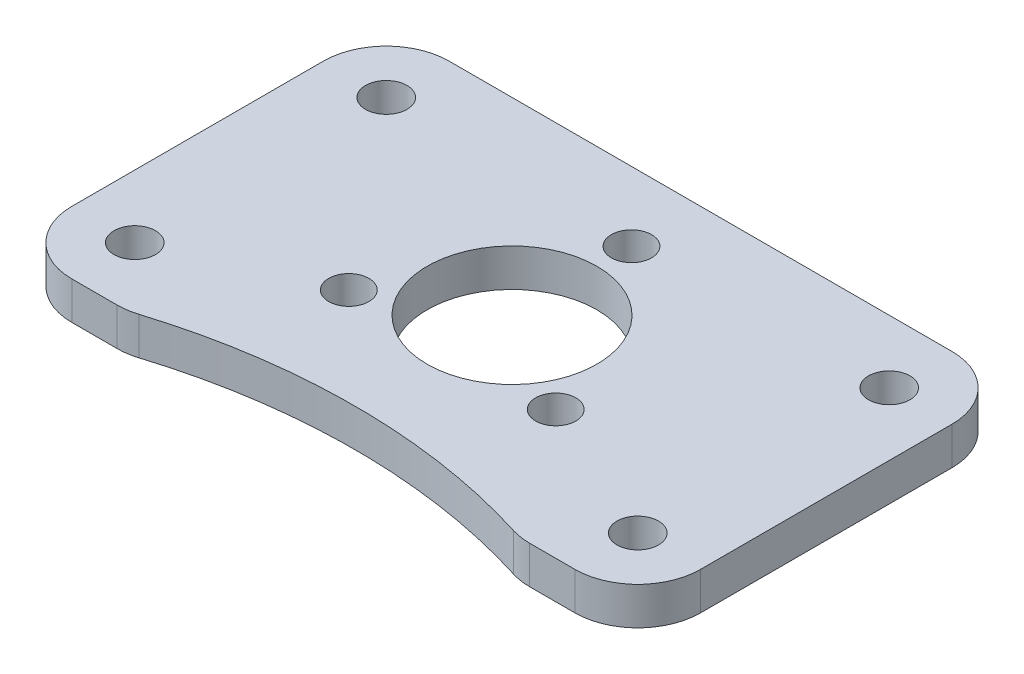
ISO-10303-21;
HEADER;
FILE_DESCRIPTION(('STEP AP214'),'2;1');
FILE_NAME('part.step','',(''),(''),'','','');
FILE_SCHEMA(('AUTOMOTIVE_DESIGN { 1 0 10303 214 1 1 1 1 }'));
ENDSEC;
DATA;
#1=APPLICATION_CONTEXT('core data for automotive mechanical design processes');
#2=APPLICATION_PROTOCOL_DEFINITION('international standard','automotive_design',2000,#1);
#3=PRODUCT_CONTEXT('',#1,'mechanical');
#4=PRODUCT('Part','Part','',(#3));
#5=PRODUCT_RELATED_PRODUCT_CATEGORY('part','',(#4));
#6=PRODUCT_DEFINITION_FORMATION('','',#4);
#7=PRODUCT_DEFINITION_CONTEXT('part definition',#1,'design');
#8=PRODUCT_DEFINITION('design','',#6,#7);
#9=PRODUCT_DEFINITION_SHAPE('','',#8);
#10=(LENGTH_UNIT() NAMED_UNIT(*) SI_UNIT(.MILLI.,.METRE.));
#11=(NAMED_UNIT(*) PLANE_ANGLE_UNIT() SI_UNIT($,.RADIAN.));
#12=(NAMED_UNIT(*) SI_UNIT($,.STERADIAN.) SOLID_ANGLE_UNIT());
#13=UNCERTAINTY_MEASURE_WITH_UNIT(LENGTH_MEASURE(1.E-05),#10,'distance_accuracy_value','');
#14=(GEOMETRIC_REPRESENTATION_CONTEXT(3) GLOBAL_UNCERTAINTY_ASSIGNED_CONTEXT((#13)) GLOBAL_UNIT_ASSIGNED_CONTEXT((#10,
#11,#12)) REPRESENTATION_CONTEXT('',''));
#15=CARTESIAN_POINT('',(0.,0.,0.));
#16=DIRECTION('',(0.,0.,1.));
#17=DIRECTION('',(1.,0.,0.));
#18=AXIS2_PLACEMENT_3D('',#15,#16,#17);
#19=CARTESIAN_POINT('',(25.,3.,47.5));
#20=DIRECTION('',(0.,1.,0.));
#21=DIRECTION('',(0.,0.,1.));
#22=AXIS2_PLACEMENT_3D('',#19,#20,#21);
#23=PLANE('',#22);
#24=CARTESIAN_POINT('',(33.2272413359522,3.,-10.25));
#25=DIRECTION('',(0.,1.,0.));
#26=DIRECTION('',(0.,0.,1.));
#27=AXIS2_PLACEMENT_3D('',#24,#25,#26);
#28=CIRCLE('',#27,1.6);
#29=CARTESIAN_POINT('',(33.2272413359522,3.,-8.65));
#30=VERTEX_POINT('',#29);
#31=EDGE_CURVE('E268',#30,#30,#28,.T.);
#32=ORIENTED_EDGE('',*,*,#31,.F.);
#33=EDGE_LOOP('',(#32));
#34=FACE_BOUND('',#33,.T.);
#35=CARTESIAN_POINT('',(25.,3.,-15.));
#36=DIRECTION('',(0.,1.,0.));
#37=DIRECTION('',(0.,0.,1.));
#38=AXIS2_PLACEMENT_3D('',#35,#36,#37);
#39=CIRCLE('',#38,6.75);
#40=CARTESIAN_POINT('',(25.,3.,-8.25));
#41=VERTEX_POINT('',#40);
#42=EDGE_CURVE('E262',#41,#41,#39,.T.);
#43=ORIENTED_EDGE('',*,*,#42,.F.);
#44=EDGE_LOOP('',(#43));
#45=FACE_BOUND('',#44,.T.);
#46=CARTESIAN_POINT('',(5.00000000000001,3.,-25.));
#47=DIRECTION('',(0.,1.,0.));
#48=DIRECTION('',(0.,0.,1.));
#49=AXIS2_PLACEMENT_3D('',#46,#47,#48);
#50=CIRCLE('',#49,1.65);
#51=CARTESIAN_POINT('',(5.00000000000001,3.,-23.35));
#52=VERTEX_POINT('',#51);
#53=EDGE_CURVE('E256',#52,#52,#50,.T.);
#54=ORIENTED_EDGE('',*,*,#53,.F.);
#55=EDGE_LOOP('',(#54));
#56=FACE_BOUND('',#55,.T.);
#57=CARTESIAN_POINT('',(45.,3.,-5.));
#58=DIRECTION('',(0.,1.,0.));
#59=DIRECTION('',(0.,0.,1.));
#60=AXIS2_PLACEMENT_3D('',#57,#58,#59);
#61=CIRCLE('',#60,1.65);
#62=CARTESIAN_POINT('',(45.,3.,-3.35));
#63=VERTEX_POINT('',#62);
#64=EDGE_CURVE('E251',#63,#63,#61,.T.);
#65=ORIENTED_EDGE('',*,*,#64,.F.);
#66=EDGE_LOOP('',(#65));
#67=FACE_BOUND('',#66,.T.);
#68=DIRECTION('',(1.,0.,0.));
#69=VECTOR('',#68,1.);
#70=CARTESIAN_POINT('',(40.612494995996,3.,0.));
#71=LINE('',#70,#69);
#72=CARTESIAN_POINT('',(41.393596310755,3.,0.));
#73=VERTEX_POINT('',#72);
#74=CARTESIAN_POINT('',(45.,3.,0.));
#75=VERTEX_POINT('',#74);
#76=EDGE_CURVE('E205',#73,#75,#71,.T.);
#77=ORIENTED_EDGE('',*,*,#76,.T.);
#78=CARTESIAN_POINT('',(45.,3.,-5.));
#79=DIRECTION('',(0.,1.,0.));
#80=DIRECTION('',(0.,0.,1.));
#81=AXIS2_PLACEMENT_3D('',#78,#79,#80);
#82=CIRCLE('',#81,5.);
#83=CARTESIAN_POINT('',(50.,3.,-5.));
#84=VERTEX_POINT('',#83);
#85=EDGE_CURVE('E217',#75,#84,#82,.T.);
#86=ORIENTED_EDGE('',*,*,#85,.T.);
#87=DIRECTION('',(0.,0.,-1.));
#88=VECTOR('',#87,1.);
#89=CARTESIAN_POINT('',(50.,3.,0.));
#90=LINE('',#89,#88);
#91=CARTESIAN_POINT('',(50.,3.,-25.));
#92=VERTEX_POINT('',#91);
#93=EDGE_CURVE('E149',#84,#92,#90,.T.);
#94=ORIENTED_EDGE('',*,*,#93,.T.);
#95=CARTESIAN_POINT('',(45.,3.,-25.));
#96=DIRECTION('',(0.,1.,0.));
#97=DIRECTION('',(0.,0.,1.));
#98=AXIS2_PLACEMENT_3D('',#95,#96,#97);
#99=CIRCLE('',#98,5.);
#100=CARTESIAN_POINT('',(45.,3.,-30.));
#101=VERTEX_POINT('',#100);
#102=EDGE_CURVE('E61',#92,#101,#99,.T.);
#103=ORIENTED_EDGE('',*,*,#102,.T.);
#104=DIRECTION('',(-1.,0.,0.));
#105=VECTOR('',#104,1.);
#106=CARTESIAN_POINT('',(0.,3.,-30.));
#107=LINE('',#106,#105);
#108=CARTESIAN_POINT('',(5.,3.,-30.));
#109=VERTEX_POINT('',#108);
#110=EDGE_CURVE('E166',#101,#109,#107,.T.);
#111=ORIENTED_EDGE('',*,*,#110,.T.);
#112=CARTESIAN_POINT('',(5.,3.,-25.));
#113=DIRECTION('',(0.,1.,0.));
#114=DIRECTION('',(0.,0.,1.));
#115=AXIS2_PLACEMENT_3D('',#112,#113,#114);
#116=CIRCLE('',#115,5.);
#117=CARTESIAN_POINT('',(0.,3.,-25.));
#118=VERTEX_POINT('',#117);
#119=EDGE_CURVE('E239',#109,#118,#116,.T.);
#120=ORIENTED_EDGE('',*,*,#119,.T.);
#121=DIRECTION('',(0.,0.,1.));
#122=VECTOR('',#121,1.);
#123=CARTESIAN_POINT('',(0.,3.,0.));
#124=LINE('',#123,#122);
#125=CARTESIAN_POINT('',(0.,3.,-5.));
#126=VERTEX_POINT('',#125);
#127=EDGE_CURVE('E160',#118,#126,#124,.T.);
#128=ORIENTED_EDGE('',*,*,#127,.T.);
#129=CARTESIAN_POINT('',(5.,3.,-5.));
#130=DIRECTION('',(0.,1.,0.));
#131=DIRECTION('',(0.,0.,1.));
#132=AXIS2_PLACEMENT_3D('',#129,#130,#131);
#133=CIRCLE('',#132,5.);
#134=CARTESIAN_POINT('',(5.,3.,0.));
#135=VERTEX_POINT('',#134);
#136=EDGE_CURVE('E178',#126,#135,#133,.T.);
#137=ORIENTED_EDGE('',*,*,#136,.T.);
#138=DIRECTION('',(1.,0.,0.));
#139=VECTOR('',#138,1.);
#140=CARTESIAN_POINT('',(0.,3.,0.));
#141=LINE('',#140,#139);
#142=CARTESIAN_POINT('',(8.606403689245,3.,0.));
#143=VERTEX_POINT('',#142);
#144=EDGE_CURVE('E193',#135,#143,#141,.T.);
#145=ORIENTED_EDGE('',*,*,#144,.T.);
#146=CARTESIAN_POINT('',(8.606403689245,3.,-5.));
#147=DIRECTION('',(0.,1.,0.));
#148=DIRECTION('',(0.,0.,1.));
#149=AXIS2_PLACEMENT_3D('',#146,#147,#148);
#150=CIRCLE('',#149,5.);
#151=CARTESIAN_POINT('',(10.0967306265864,3.,-0.227272727272729));
#152=VERTEX_POINT('',#151);
#153=EDGE_CURVE('E218',#143,#152,#150,.T.);
#154=ORIENTED_EDGE('',*,*,#153,.T.);
#155=CARTESIAN_POINT('',(25.,3.,47.5));
#156=DIRECTION('',(0.,-1.,0.));
#157=DIRECTION('',(0.,0.,1.));
#158=AXIS2_PLACEMENT_3D('',#155,#156,#157);
#159=CIRCLE('',#158,50.);
#160=CARTESIAN_POINT('',(39.9032693734137,3.,-0.227272727272729));
#161=VERTEX_POINT('',#160);
#162=EDGE_CURVE('E198',#152,#161,#159,.T.);
#163=ORIENTED_EDGE('',*,*,#162,.T.);
#164=CARTESIAN_POINT('',(41.393596310755,3.,-5.));
#165=DIRECTION('',(0.,1.,0.));
#166=DIRECTION('',(0.,0.,1.));
#167=AXIS2_PLACEMENT_3D('',#164,#165,#166);
#168=CIRCLE('',#167,5.);
#169=EDGE_CURVE('E213',#161,#73,#168,.T.);
#170=ORIENTED_EDGE('',*,*,#169,.T.);
#171=EDGE_LOOP('',(#77,#86,#94,#103,#111,#120,#128,#137,#145,#154,#163,#170));
#172=FACE_BOUND('',#171,.T.);
#173=CARTESIAN_POINT('',(5.,3.,-5.));
#174=DIRECTION('',(0.,1.,0.));
#175=DIRECTION('',(0.,0.,-1.));
#176=AXIS2_PLACEMENT_3D('',#173,#174,#175);
#177=CIRCLE('',#176,1.65);
#178=CARTESIAN_POINT('',(5.,3.,-6.65));
#179=VERTEX_POINT('',#178);
#180=EDGE_CURVE('E428',#179,#179,#177,.T.);
#181=ORIENTED_EDGE('',*,*,#180,.F.);
#182=EDGE_LOOP('',(#181));
#183=FACE_BOUND('',#182,.T.);
#184=CARTESIAN_POINT('',(45.,3.,-25.));
#185=DIRECTION('',(0.,1.,0.));
#186=DIRECTION('',(0.,0.,-1.));
#187=AXIS2_PLACEMENT_3D('',#184,#185,#186);
#188=CIRCLE('',#187,1.65);
#189=CARTESIAN_POINT('',(45.,3.,-26.65));
#190=VERTEX_POINT('',#189);
#191=EDGE_CURVE('E292',#190,#190,#188,.T.);
#192=ORIENTED_EDGE('',*,*,#191,.F.);
#193=EDGE_LOOP('',(#192));
#194=FACE_BOUND('',#193,.T.);
#195=CARTESIAN_POINT('',(25.,3.,-24.5));
#196=DIRECTION('',(0.,1.,0.));
#197=DIRECTION('',(0.,0.,1.));
#198=AXIS2_PLACEMENT_3D('',#195,#196,#197);
#199=CIRCLE('',#198,1.6);
#200=CARTESIAN_POINT('',(25.,3.,-22.9));
#201=VERTEX_POINT('',#200);
#202=EDGE_CURVE('E276',#201,#201,#199,.T.);
#203=ORIENTED_EDGE('',*,*,#202,.F.);
#204=EDGE_LOOP('',(#203));
#205=FACE_BOUND('',#204,.T.);
#206=CARTESIAN_POINT('',(16.7727586640478,3.,-10.25));
#207=DIRECTION('',(0.,1.,0.));
#208=DIRECTION('',(0.,0.,1.));
#209=AXIS2_PLACEMENT_3D('',#206,#207,#208);
#210=CIRCLE('',#209,1.6);
#211=CARTESIAN_POINT('',(16.7727586640478,3.,-8.65));
#212=VERTEX_POINT('',#211);
#213=EDGE_CURVE('E279',#212,#212,#210,.T.);
#214=ORIENTED_EDGE('',*,*,#213,.F.);
#215=EDGE_LOOP('',(#214));
#216=FACE_BOUND('',#215,.T.);
#217=ADVANCED_FACE('F41',(#34,#45,#56,#67,#172,#183,#194,#205,#216),#23,.T.);
#218=CARTESIAN_POINT('',(25.,0.,47.5));
#219=DIRECTION('',(0.,1.,0.));
#220=DIRECTION('',(0.,0.,1.));
#221=AXIS2_PLACEMENT_3D('',#218,#219,#220);
#222=PLANE('',#221);
#223=DIRECTION('',(0.,0.,-1.));
#224=VECTOR('',#223,1.);
#225=CARTESIAN_POINT('',(50.,0.,0.));
#226=LINE('',#225,#224);
#227=CARTESIAN_POINT('',(50.,0.,-5.));
#228=VERTEX_POINT('',#227);
#229=CARTESIAN_POINT('',(50.,0.,-25.));
#230=VERTEX_POINT('',#229);
#231=EDGE_CURVE('E147',#228,#230,#226,.T.);
#232=ORIENTED_EDGE('',*,*,#231,.F.);
#233=CARTESIAN_POINT('',(45.,0.,-5.));
#234=DIRECTION('',(0.,1.,0.));
#235=DIRECTION('',(0.,0.,1.));
#236=AXIS2_PLACEMENT_3D('',#233,#234,#235);
#237=CIRCLE('',#236,5.);
#238=CARTESIAN_POINT('',(45.,0.,0.));
#239=VERTEX_POINT('',#238);
#240=EDGE_CURVE('E130',#228,#239,#237,.F.);
#241=ORIENTED_EDGE('',*,*,#240,.T.);
#242=DIRECTION('',(1.,0.,0.));
#243=VECTOR('',#242,1.);
#244=CARTESIAN_POINT('',(40.612494995996,0.,0.));
#245=LINE('',#244,#243);
#246=CARTESIAN_POINT('',(41.393596310755,0.,0.));
#247=VERTEX_POINT('',#246);
#248=EDGE_CURVE('E158',#247,#239,#245,.T.);
#249=ORIENTED_EDGE('',*,*,#248,.F.);
#250=CARTESIAN_POINT('',(41.393596310755,0.,-5.));
#251=DIRECTION('',(0.,1.,0.));
#252=DIRECTION('',(0.,0.,1.));
#253=AXIS2_PLACEMENT_3D('',#250,#251,#252);
#254=CIRCLE('',#253,5.);
#255=CARTESIAN_POINT('',(39.9032693734137,0.,-0.227272727272729));
#256=VERTEX_POINT('',#255);
#257=EDGE_CURVE('E141',#247,#256,#254,.F.);
#258=ORIENTED_EDGE('',*,*,#257,.T.);
#259=CARTESIAN_POINT('',(25.,0.,47.5));
#260=DIRECTION('',(0.,-1.,0.));
#261=DIRECTION('',(0.,0.,1.));
#262=AXIS2_PLACEMENT_3D('',#259,#260,#261);
#263=CIRCLE('',#262,50.);
#264=CARTESIAN_POINT('',(10.0967306265864,0.,-0.227272727272729));
#265=VERTEX_POINT('',#264);
#266=EDGE_CURVE('E162',#265,#256,#263,.T.);
#267=ORIENTED_EDGE('',*,*,#266,.F.);
#268=CARTESIAN_POINT('',(8.606403689245,0.,-5.));
#269=DIRECTION('',(0.,1.,0.));
#270=DIRECTION('',(0.,0.,1.));
#271=AXIS2_PLACEMENT_3D('',#268,#269,#270);
#272=CIRCLE('',#271,5.);
#273=CARTESIAN_POINT('',(8.606403689245,0.,0.));
#274=VERTEX_POINT('',#273);
#275=EDGE_CURVE('E172',#265,#274,#272,.F.);
#276=ORIENTED_EDGE('',*,*,#275,.T.);
#277=DIRECTION('',(1.,0.,0.));
#278=VECTOR('',#277,1.);
#279=CARTESIAN_POINT('',(0.,0.,0.));
#280=LINE('',#279,#278);
#281=CARTESIAN_POINT('',(5.,0.,0.));
#282=VERTEX_POINT('',#281);
#283=EDGE_CURVE('E414',#282,#274,#280,.T.);
#284=ORIENTED_EDGE('',*,*,#283,.F.);
#285=CARTESIAN_POINT('',(5.,0.,-5.));
#286=DIRECTION('',(0.,1.,0.));
#287=DIRECTION('',(0.,0.,1.));
#288=AXIS2_PLACEMENT_3D('',#285,#286,#287);
#289=CIRCLE('',#288,5.);
#290=CARTESIAN_POINT('',(0.,0.,-5.));
#291=VERTEX_POINT('',#290);
#292=EDGE_CURVE('E150',#282,#291,#289,.F.);
#293=ORIENTED_EDGE('',*,*,#292,.T.);
#294=DIRECTION('',(0.,0.,1.));
#295=VECTOR('',#294,1.);
#296=CARTESIAN_POINT('',(0.,0.,0.));
#297=LINE('',#296,#295);
#298=CARTESIAN_POINT('',(0.,0.,-25.));
#299=VERTEX_POINT('',#298);
#300=EDGE_CURVE('E237',#299,#291,#297,.T.);
#301=ORIENTED_EDGE('',*,*,#300,.F.);
#302=CARTESIAN_POINT('',(5.,0.,-25.));
#303=DIRECTION('',(0.,1.,0.));
#304=DIRECTION('',(0.,0.,1.));
#305=AXIS2_PLACEMENT_3D('',#302,#303,#304);
#306=CIRCLE('',#305,5.);
#307=CARTESIAN_POINT('',(5.,0.,-30.));
#308=VERTEX_POINT('',#307);
#309=EDGE_CURVE('E170',#299,#308,#306,.F.);
#310=ORIENTED_EDGE('',*,*,#309,.T.);
#311=DIRECTION('',(-1.,0.,0.));
#312=VECTOR('',#311,1.);
#313=CARTESIAN_POINT('',(0.,0.,-30.));
#314=LINE('',#313,#312);
#315=CARTESIAN_POINT('',(45.,0.,-30.));
#316=VERTEX_POINT('',#315);
#317=EDGE_CURVE('E157',#316,#308,#314,.T.);
#318=ORIENTED_EDGE('',*,*,#317,.F.);
#319=CARTESIAN_POINT('',(45.,0.,-25.));
#320=DIRECTION('',(0.,1.,0.));
#321=DIRECTION('',(0.,0.,1.));
#322=AXIS2_PLACEMENT_3D('',#319,#320,#321);
#323=CIRCLE('',#322,5.);
#324=EDGE_CURVE('E156',#316,#230,#323,.F.);
#325=ORIENTED_EDGE('',*,*,#324,.T.);
#326=EDGE_LOOP('',(#232,#241,#249,#258,#267,#276,#284,#293,#301,#310,#318,#325));
#327=FACE_BOUND('',#326,.T.);
#328=CARTESIAN_POINT('',(45.,0.,-5.));
#329=DIRECTION('',(0.,1.,0.));
#330=DIRECTION('',(0.,0.,1.));
#331=AXIS2_PLACEMENT_3D('',#328,#329,#330);
#332=CIRCLE('',#331,1.65);
#333=CARTESIAN_POINT('',(45.,0.,-3.35));
#334=VERTEX_POINT('',#333);
#335=EDGE_CURVE('E254',#334,#334,#332,.T.);
#336=ORIENTED_EDGE('',*,*,#335,.T.);
#337=EDGE_LOOP('',(#336));
#338=FACE_BOUND('',#337,.T.);
#339=CARTESIAN_POINT('',(5.,0.,-5.));
#340=DIRECTION('',(0.,1.,0.));
#341=DIRECTION('',(0.,0.,-1.));
#342=AXIS2_PLACEMENT_3D('',#339,#340,#341);
#343=CIRCLE('',#342,1.65);
#344=CARTESIAN_POINT('',(5.,0.,-6.65));
#345=VERTEX_POINT('',#344);
#346=EDGE_CURVE('E259',#345,#345,#343,.T.);
#347=ORIENTED_EDGE('',*,*,#346,.T.);
#348=EDGE_LOOP('',(#347));
#349=FACE_BOUND('',#348,.T.);
#350=CARTESIAN_POINT('',(5.00000000000001,0.,-25.));
#351=DIRECTION('',(0.,1.,0.));
#352=DIRECTION('',(0.,0.,1.));
#353=AXIS2_PLACEMENT_3D('',#350,#351,#352);
#354=CIRCLE('',#353,1.65);
#355=CARTESIAN_POINT('',(5.00000000000001,0.,-23.35));
#356=VERTEX_POINT('',#355);
#357=EDGE_CURVE('E260',#356,#356,#354,.T.);
#358=ORIENTED_EDGE('',*,*,#357,.T.);
#359=EDGE_LOOP('',(#358));
#360=FACE_BOUND('',#359,.T.);
#361=CARTESIAN_POINT('',(45.,0.,-25.));
#362=DIRECTION('',(0.,1.,0.));
#363=DIRECTION('',(0.,0.,-1.));
#364=AXIS2_PLACEMENT_3D('',#361,#362,#363);
#365=CIRCLE('',#364,1.65);
#366=CARTESIAN_POINT('',(45.,0.,-26.65));
#367=VERTEX_POINT('',#366);
#368=EDGE_CURVE('E265',#367,#367,#365,.T.);
#369=ORIENTED_EDGE('',*,*,#368,.T.);
#370=EDGE_LOOP('',(#369));
#371=FACE_BOUND('',#370,.T.);
#372=CARTESIAN_POINT('',(25.,0.,-15.));
#373=DIRECTION('',(0.,1.,0.));
#374=DIRECTION('',(0.,0.,1.));
#375=AXIS2_PLACEMENT_3D('',#372,#373,#374);
#376=CIRCLE('',#375,6.75);
#377=CARTESIAN_POINT('',(25.,0.,-8.25));
#378=VERTEX_POINT('',#377);
#379=EDGE_CURVE('E266',#378,#378,#376,.T.);
#380=ORIENTED_EDGE('',*,*,#379,.T.);
#381=EDGE_LOOP('',(#380));
#382=FACE_BOUND('',#381,.T.);
#383=CARTESIAN_POINT('',(25.,0.,-24.5));
#384=DIRECTION('',(0.,1.,0.));
#385=DIRECTION('',(0.,0.,1.));
#386=AXIS2_PLACEMENT_3D('',#383,#384,#385);
#387=CIRCLE('',#386,1.6);
#388=CARTESIAN_POINT('',(25.,0.,-22.9));
#389=VERTEX_POINT('',#388);
#390=EDGE_CURVE('E270',#389,#389,#387,.T.);
#391=ORIENTED_EDGE('',*,*,#390,.T.);
#392=EDGE_LOOP('',(#391));
#393=FACE_BOUND('',#392,.T.);
#394=CARTESIAN_POINT('',(33.2272413359522,0.,-10.25));
#395=DIRECTION('',(0.,1.,0.));
#396=DIRECTION('',(0.,0.,1.));
#397=AXIS2_PLACEMENT_3D('',#394,#395,#396);
#398=CIRCLE('',#397,1.6);
#399=CARTESIAN_POINT('',(33.2272413359522,0.,-8.65));
#400=VERTEX_POINT('',#399);
#401=EDGE_CURVE('E271',#400,#400,#398,.T.);
#402=ORIENTED_EDGE('',*,*,#401,.T.);
#403=EDGE_LOOP('',(#402));
#404=FACE_BOUND('',#403,.T.);
#405=CARTESIAN_POINT('',(16.7727586640478,0.,-10.25));
#406=DIRECTION('',(0.,1.,0.));
#407=DIRECTION('',(0.,0.,1.));
#408=AXIS2_PLACEMENT_3D('',#405,#406,#407);
#409=CIRCLE('',#408,1.6);
#410=CARTESIAN_POINT('',(16.7727586640478,0.,-8.65));
#411=VERTEX_POINT('',#410);
#412=EDGE_CURVE('E283',#411,#411,#409,.T.);
#413=ORIENTED_EDGE('',*,*,#412,.T.);
#414=EDGE_LOOP('',(#413));
#415=FACE_BOUND('',#414,.T.);
#416=ADVANCED_FACE('F153',(#327,#338,#349,#360,#371,#382,#393,#404,#415),#222,.F.);
#417=CARTESIAN_POINT('',(0.,3.,0.));
#418=DIRECTION('',(1.,0.,0.));
#419=DIRECTION('',(0.,0.,-1.));
#420=AXIS2_PLACEMENT_3D('',#417,#418,#419);
#421=PLANE('',#420);
#422=ORIENTED_EDGE('',*,*,#127,.F.);
#423=DIRECTION('',(0.,-1.,0.));
#424=VECTOR('',#423,1.);
#425=CARTESIAN_POINT('',(0.,3.,-25.));
#426=LINE('',#425,#424);
#427=EDGE_CURVE('E394',#118,#299,#426,.T.);
#428=ORIENTED_EDGE('',*,*,#427,.T.);
#429=ORIENTED_EDGE('',*,*,#300,.T.);
#430=DIRECTION('',(0.,-1.,0.));
#431=VECTOR('',#430,1.);
#432=CARTESIAN_POINT('',(0.,3.,-5.));
#433=LINE('',#432,#431);
#434=EDGE_CURVE('E396',#291,#126,#433,.F.);
#435=ORIENTED_EDGE('',*,*,#434,.T.);
#436=EDGE_LOOP('',(#422,#428,#429,#435));
#437=FACE_BOUND('',#436,.T.);
#438=ADVANCED_FACE('F355',(#437),#421,.F.);
#439=CARTESIAN_POINT('',(0.,3.,0.));
#440=DIRECTION('',(0.,0.,-1.));
#441=DIRECTION('',(-1.,0.,0.));
#442=AXIS2_PLACEMENT_3D('',#439,#440,#441);
#443=PLANE('',#442);
#444=ORIENTED_EDGE('',*,*,#283,.T.);
#445=DIRECTION('',(0.,-1.,0.));
#446=VECTOR('',#445,1.);
#447=CARTESIAN_POINT('',(8.606403689245,3.,0.));
#448=LINE('',#447,#446);
#449=EDGE_CURVE('E400',#274,#143,#448,.F.);
#450=ORIENTED_EDGE('',*,*,#449,.T.);
#451=ORIENTED_EDGE('',*,*,#144,.F.);
#452=DIRECTION('',(0.,-1.,0.));
#453=VECTOR('',#452,1.);
#454=CARTESIAN_POINT('',(5.,3.,0.));
#455=LINE('',#454,#453);
#456=EDGE_CURVE('E402',#135,#282,#455,.T.);
#457=ORIENTED_EDGE('',*,*,#456,.T.);
#458=EDGE_LOOP('',(#444,#450,#451,#457));
#459=FACE_BOUND('',#458,.T.);
#460=ADVANCED_FACE('F367',(#459),#443,.F.);
#461=CARTESIAN_POINT('',(25.,3.,47.5));
#462=DIRECTION('',(0.,-1.,0.));
#463=DIRECTION('',(0.,0.,-1.));
#464=AXIS2_PLACEMENT_3D('',#461,#462,#463);
#465=CYLINDRICAL_SURFACE('',#464,50.);
#466=ORIENTED_EDGE('',*,*,#266,.T.);
#467=DIRECTION('',(0.,-1.,0.));
#468=VECTOR('',#467,1.);
#469=CARTESIAN_POINT('',(39.9032693734137,3.,-0.227272727272729));
#470=LINE('',#469,#468);
#471=EDGE_CURVE('E404',#256,#161,#470,.F.);
#472=ORIENTED_EDGE('',*,*,#471,.T.);
#473=ORIENTED_EDGE('',*,*,#162,.F.);
#474=DIRECTION('',(0.,-1.,0.));
#475=VECTOR('',#474,1.);
#476=CARTESIAN_POINT('',(10.0967306265864,3.,-0.227272727272729));
#477=LINE('',#476,#475);
#478=EDGE_CURVE('E223',#152,#265,#477,.T.);
#479=ORIENTED_EDGE('',*,*,#478,.T.);
#480=EDGE_LOOP('',(#466,#472,#473,#479));
#481=FACE_BOUND('',#480,.T.);
#482=ADVANCED_FACE('F363',(#481),#465,.F.);
#483=CARTESIAN_POINT('',(40.612494995996,3.,0.));
#484=DIRECTION('',(0.,0.,-1.));
#485=DIRECTION('',(-1.,0.,0.));
#486=AXIS2_PLACEMENT_3D('',#483,#484,#485);
#487=PLANE('',#486);
#488=ORIENTED_EDGE('',*,*,#248,.T.);
#489=DIRECTION('',(0.,-1.,0.));
#490=VECTOR('',#489,1.);
#491=CARTESIAN_POINT('',(45.,3.,0.));
#492=LINE('',#491,#490);
#493=EDGE_CURVE('E135',#239,#75,#492,.F.);
#494=ORIENTED_EDGE('',*,*,#493,.T.);
#495=ORIENTED_EDGE('',*,*,#76,.F.);
#496=DIRECTION('',(0.,-1.,0.));
#497=VECTOR('',#496,1.);
#498=CARTESIAN_POINT('',(41.393596310755,3.,0.));
#499=LINE('',#498,#497);
#500=EDGE_CURVE('E140',#73,#247,#499,.T.);
#501=ORIENTED_EDGE('',*,*,#500,.T.);
#502=EDGE_LOOP('',(#488,#494,#495,#501));
#503=FACE_BOUND('',#502,.T.);
#504=ADVANCED_FACE('F360',(#503),#487,.F.);
#505=CARTESIAN_POINT('',(50.,3.,0.));
#506=DIRECTION('',(-1.,0.,0.));
#507=DIRECTION('',(0.,0.,1.));
#508=AXIS2_PLACEMENT_3D('',#505,#506,#507);
#509=PLANE('',#508);
#510=ORIENTED_EDGE('',*,*,#93,.F.);
#511=DIRECTION('',(0.,-1.,0.));
#512=VECTOR('',#511,1.);
#513=CARTESIAN_POINT('',(50.,3.,-5.));
#514=LINE('',#513,#512);
#515=EDGE_CURVE('E134',#84,#228,#514,.T.);
#516=ORIENTED_EDGE('',*,*,#515,.T.);
#517=ORIENTED_EDGE('',*,*,#231,.T.);
#518=DIRECTION('',(0.,-1.,0.));
#519=VECTOR('',#518,1.);
#520=CARTESIAN_POINT('',(50.,3.,-25.));
#521=LINE('',#520,#519);
#522=EDGE_CURVE('E151',#230,#92,#521,.F.);
#523=ORIENTED_EDGE('',*,*,#522,.T.);
#524=EDGE_LOOP('',(#510,#516,#517,#523));
#525=FACE_BOUND('',#524,.T.);
#526=ADVANCED_FACE('F146',(#525),#509,.F.);
#527=CARTESIAN_POINT('',(0.,3.,-30.));
#528=DIRECTION('',(0.,0.,1.));
#529=DIRECTION('',(1.,0.,0.));
#530=AXIS2_PLACEMENT_3D('',#527,#528,#529);
#531=PLANE('',#530);
#532=ORIENTED_EDGE('',*,*,#317,.T.);
#533=DIRECTION('',(0.,-1.,0.));
#534=VECTOR('',#533,1.);
#535=CARTESIAN_POINT('',(5.,3.,-30.));
#536=LINE('',#535,#534);
#537=EDGE_CURVE('E12',#308,#109,#536,.F.);
#538=ORIENTED_EDGE('',*,*,#537,.T.);
#539=ORIENTED_EDGE('',*,*,#110,.F.);
#540=DIRECTION('',(0.,-1.,0.));
#541=VECTOR('',#540,1.);
#542=CARTESIAN_POINT('',(45.,3.,-30.));
#543=LINE('',#542,#541);
#544=EDGE_CURVE('E49',#101,#316,#543,.T.);
#545=ORIENTED_EDGE('',*,*,#544,.T.);
#546=EDGE_LOOP('',(#532,#538,#539,#545));
#547=FACE_BOUND('',#546,.T.);
#548=ADVANCED_FACE('F350',(#547),#531,.F.);
#549=CARTESIAN_POINT('',(45.,3.,-5.));
#550=DIRECTION('',(0.,-1.,0.));
#551=DIRECTION('',(0.,0.,-1.));
#552=AXIS2_PLACEMENT_3D('',#549,#550,#551);
#553=CYLINDRICAL_SURFACE('',#552,1.65);
#554=ORIENTED_EDGE('',*,*,#64,.T.);
#555=EDGE_LOOP('',(#554));
#556=FACE_BOUND('',#555,.T.);
#557=ORIENTED_EDGE('',*,*,#335,.F.);
#558=EDGE_LOOP('',(#557));
#559=FACE_BOUND('',#558,.T.);
#560=ADVANCED_FACE('F347',(#556,#559),#553,.F.);
#561=CARTESIAN_POINT('',(5.,3.,-5.));
#562=DIRECTION('',(0.,-1.,0.));
#563=DIRECTION('',(0.,0.,-1.));
#564=AXIS2_PLACEMENT_3D('',#561,#562,#563);
#565=CYLINDRICAL_SURFACE('',#564,1.65);
#566=ORIENTED_EDGE('',*,*,#180,.T.);
#567=EDGE_LOOP('',(#566));
#568=FACE_BOUND('',#567,.T.);
#569=ORIENTED_EDGE('',*,*,#346,.F.);
#570=EDGE_LOOP('',(#569));
#571=FACE_BOUND('',#570,.T.);
#572=ADVANCED_FACE('F343',(#568,#571),#565,.F.);
#573=CARTESIAN_POINT('',(5.00000000000001,3.,-25.));
#574=DIRECTION('',(0.,-1.,0.));
#575=DIRECTION('',(0.,0.,-1.));
#576=AXIS2_PLACEMENT_3D('',#573,#574,#575);
#577=CYLINDRICAL_SURFACE('',#576,1.65);
#578=ORIENTED_EDGE('',*,*,#53,.T.);
#579=EDGE_LOOP('',(#578));
#580=FACE_BOUND('',#579,.T.);
#581=ORIENTED_EDGE('',*,*,#357,.F.);
#582=EDGE_LOOP('',(#581));
#583=FACE_BOUND('',#582,.T.);
#584=ADVANCED_FACE('F339',(#580,#583),#577,.F.);
#585=CARTESIAN_POINT('',(45.,3.,-25.));
#586=DIRECTION('',(0.,-1.,0.));
#587=DIRECTION('',(0.,0.,-1.));
#588=AXIS2_PLACEMENT_3D('',#585,#586,#587);
#589=CYLINDRICAL_SURFACE('',#588,1.65);
#590=ORIENTED_EDGE('',*,*,#191,.T.);
#591=EDGE_LOOP('',(#590));
#592=FACE_BOUND('',#591,.T.);
#593=ORIENTED_EDGE('',*,*,#368,.F.);
#594=EDGE_LOOP('',(#593));
#595=FACE_BOUND('',#594,.T.);
#596=ADVANCED_FACE('F335',(#592,#595),#589,.F.);
#597=CARTESIAN_POINT('',(25.,3.,-15.));
#598=DIRECTION('',(0.,-1.,0.));
#599=DIRECTION('',(0.,0.,-1.));
#600=AXIS2_PLACEMENT_3D('',#597,#598,#599);
#601=CYLINDRICAL_SURFACE('',#600,6.75);
#602=ORIENTED_EDGE('',*,*,#42,.T.);
#603=EDGE_LOOP('',(#602));
#604=FACE_BOUND('',#603,.T.);
#605=ORIENTED_EDGE('',*,*,#379,.F.);
#606=EDGE_LOOP('',(#605));
#607=FACE_BOUND('',#606,.T.);
#608=ADVANCED_FACE('F332',(#604,#607),#601,.F.);
#609=CARTESIAN_POINT('',(25.,3.,-24.5));
#610=DIRECTION('',(0.,-1.,0.));
#611=DIRECTION('',(0.,0.,-1.));
#612=AXIS2_PLACEMENT_3D('',#609,#610,#611);
#613=CYLINDRICAL_SURFACE('',#612,1.6);
#614=ORIENTED_EDGE('',*,*,#202,.T.);
#615=EDGE_LOOP('',(#614));
#616=FACE_BOUND('',#615,.T.);
#617=ORIENTED_EDGE('',*,*,#390,.F.);
#618=EDGE_LOOP('',(#617));
#619=FACE_BOUND('',#618,.T.);
#620=ADVANCED_FACE('F303',(#616,#619),#613,.F.);
#621=CARTESIAN_POINT('',(33.2272413359522,3.,-10.25));
#622=DIRECTION('',(0.,-1.,0.));
#623=DIRECTION('',(0.,0.,-1.));
#624=AXIS2_PLACEMENT_3D('',#621,#622,#623);
#625=CYLINDRICAL_SURFACE('',#624,1.6);
#626=ORIENTED_EDGE('',*,*,#31,.T.);
#627=EDGE_LOOP('',(#626));
#628=FACE_BOUND('',#627,.T.);
#629=ORIENTED_EDGE('',*,*,#401,.F.);
#630=EDGE_LOOP('',(#629));
#631=FACE_BOUND('',#630,.T.);
#632=ADVANCED_FACE('F320',(#628,#631),#625,.F.);
#633=CARTESIAN_POINT('',(16.7727586640478,3.,-10.25));
#634=DIRECTION('',(0.,-1.,0.));
#635=DIRECTION('',(0.,0.,-1.));
#636=AXIS2_PLACEMENT_3D('',#633,#634,#635);
#637=CYLINDRICAL_SURFACE('',#636,1.6);
#638=ORIENTED_EDGE('',*,*,#213,.T.);
#639=EDGE_LOOP('',(#638));
#640=FACE_BOUND('',#639,.T.);
#641=ORIENTED_EDGE('',*,*,#412,.F.);
#642=EDGE_LOOP('',(#641));
#643=FACE_BOUND('',#642,.T.);
#644=ADVANCED_FACE('F318',(#640,#643),#637,.F.);
#645=CARTESIAN_POINT('',(45.,3.,-5.));
#646=DIRECTION('',(0.,-1.,0.));
#647=DIRECTION('',(0.,0.,-1.));
#648=AXIS2_PLACEMENT_3D('',#645,#646,#647);
#649=CYLINDRICAL_SURFACE('',#648,5.);
#650=ORIENTED_EDGE('',*,*,#85,.F.);
#651=ORIENTED_EDGE('',*,*,#493,.F.);
#652=ORIENTED_EDGE('',*,*,#240,.F.);
#653=ORIENTED_EDGE('',*,*,#515,.F.);
#654=EDGE_LOOP('',(#650,#651,#652,#653));
#655=FACE_BOUND('',#654,.T.);
#656=ADVANCED_FACE('F133',(#655),#649,.T.);
#657=CARTESIAN_POINT('',(41.393596310755,3.,-5.));
#658=DIRECTION('',(0.,-1.,0.));
#659=DIRECTION('',(0.,0.,-1.));
#660=AXIS2_PLACEMENT_3D('',#657,#658,#659);
#661=CYLINDRICAL_SURFACE('',#660,5.);
#662=ORIENTED_EDGE('',*,*,#169,.F.);
#663=ORIENTED_EDGE('',*,*,#471,.F.);
#664=ORIENTED_EDGE('',*,*,#257,.F.);
#665=ORIENTED_EDGE('',*,*,#500,.F.);
#666=EDGE_LOOP('',(#662,#663,#664,#665));
#667=FACE_BOUND('',#666,.T.);
#668=ADVANCED_FACE('F326',(#667),#661,.T.);
#669=CARTESIAN_POINT('',(8.606403689245,3.,-5.));
#670=DIRECTION('',(0.,-1.,0.));
#671=DIRECTION('',(0.,0.,-1.));
#672=AXIS2_PLACEMENT_3D('',#669,#670,#671);
#673=CYLINDRICAL_SURFACE('',#672,5.);
#674=ORIENTED_EDGE('',*,*,#153,.F.);
#675=ORIENTED_EDGE('',*,*,#449,.F.);
#676=ORIENTED_EDGE('',*,*,#275,.F.);
#677=ORIENTED_EDGE('',*,*,#478,.F.);
#678=EDGE_LOOP('',(#674,#675,#676,#677));
#679=FACE_BOUND('',#678,.T.);
#680=ADVANCED_FACE('F377',(#679),#673,.T.);
#681=CARTESIAN_POINT('',(5.,3.,-25.));
#682=DIRECTION('',(0.,-1.,0.));
#683=DIRECTION('',(0.,0.,-1.));
#684=AXIS2_PLACEMENT_3D('',#681,#682,#683);
#685=CYLINDRICAL_SURFACE('',#684,5.);
#686=ORIENTED_EDGE('',*,*,#119,.F.);
#687=ORIENTED_EDGE('',*,*,#537,.F.);
#688=ORIENTED_EDGE('',*,*,#309,.F.);
#689=ORIENTED_EDGE('',*,*,#427,.F.);
#690=EDGE_LOOP('',(#686,#687,#688,#689));
#691=FACE_BOUND('',#690,.T.);
#692=ADVANCED_FACE('F381',(#691),#685,.T.);
#693=CARTESIAN_POINT('',(45.,3.,-25.));
#694=DIRECTION('',(0.,-1.,0.));
#695=DIRECTION('',(0.,0.,-1.));
#696=AXIS2_PLACEMENT_3D('',#693,#694,#695);
#697=CYLINDRICAL_SURFACE('',#696,5.);
#698=ORIENTED_EDGE('',*,*,#102,.F.);
#699=ORIENTED_EDGE('',*,*,#522,.F.);
#700=ORIENTED_EDGE('',*,*,#324,.F.);
#701=ORIENTED_EDGE('',*,*,#544,.F.);
#702=EDGE_LOOP('',(#698,#699,#700,#701));
#703=FACE_BOUND('',#702,.T.);
#704=ADVANCED_FACE('F384',(#703),#697,.T.);
#705=CARTESIAN_POINT('',(5.,3.,-5.));
#706=DIRECTION('',(0.,-1.,0.));
#707=DIRECTION('',(0.,0.,-1.));
#708=AXIS2_PLACEMENT_3D('',#705,#706,#707);
#709=CYLINDRICAL_SURFACE('',#708,5.);
#710=ORIENTED_EDGE('',*,*,#136,.F.);
#711=ORIENTED_EDGE('',*,*,#434,.F.);
#712=ORIENTED_EDGE('',*,*,#292,.F.);
#713=ORIENTED_EDGE('',*,*,#456,.F.);
#714=EDGE_LOOP('',(#710,#711,#712,#713));
#715=FACE_BOUND('',#714,.T.);
#716=ADVANCED_FACE('F43',(#715),#709,.T.);
#717=CLOSED_SHELL('',(#217,#416,#438,#460,#482,#504,#526,#548,#560,#572,#584,#596,#608,#620,
#632,#644,#656,#668,#680,#692,#704,#716));
#718=MANIFOLD_SOLID_BREP('B2',#717);
#719=ADVANCED_BREP_SHAPE_REPRESENTATION('',(#18,#718),#14);
#720=SHAPE_DEFINITION_REPRESENTATION(#9,#719);
ENDSEC;
END-ISO-10303-21;
